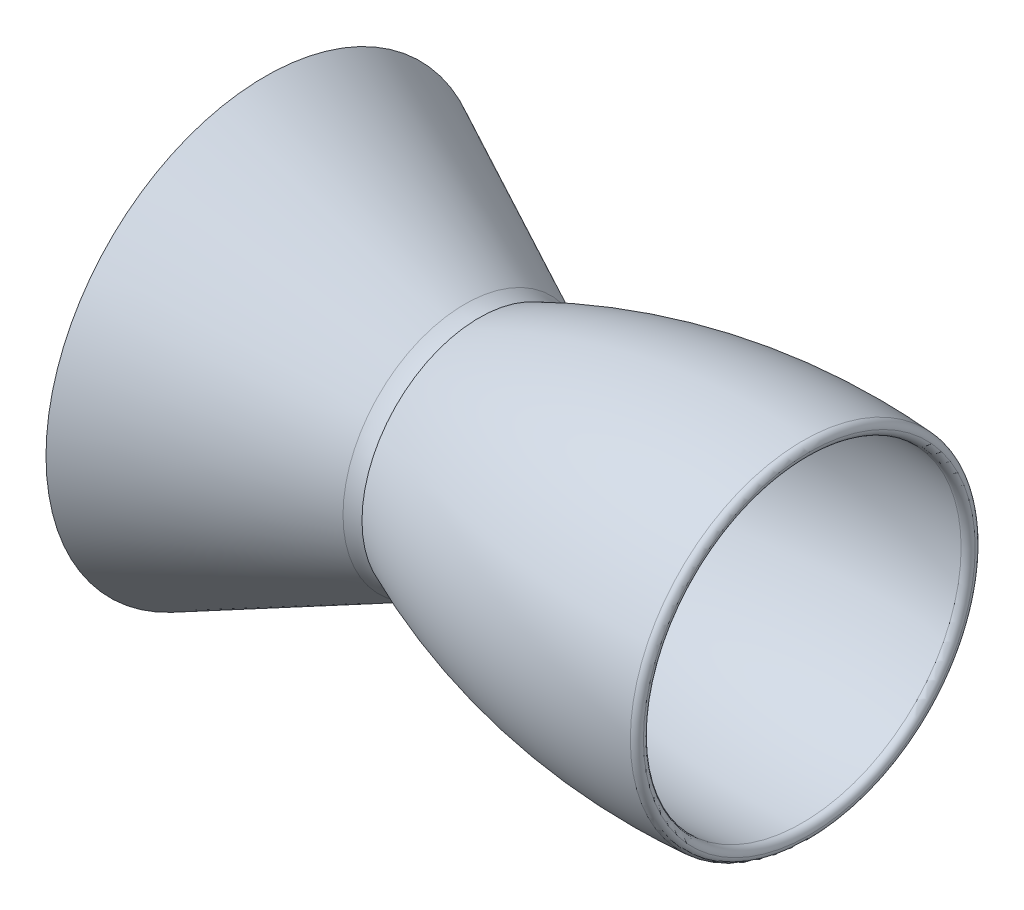
ISO-10303-21;
HEADER;
FILE_DESCRIPTION(('STEP AP214'),'2;1');
FILE_NAME('part.step','',(''),(''),'','','');
FILE_SCHEMA(('AUTOMOTIVE_DESIGN { 1 0 10303 214 1 1 1 1 }'));
ENDSEC;
DATA;
#1=APPLICATION_CONTEXT('core data for automotive mechanical design processes');
#2=APPLICATION_PROTOCOL_DEFINITION('international standard','automotive_design',2000,#1);
#3=PRODUCT_CONTEXT('',#1,'mechanical');
#4=PRODUCT('Part','Part','',(#3));
#5=PRODUCT_RELATED_PRODUCT_CATEGORY('part','',(#4));
#6=PRODUCT_DEFINITION_FORMATION('','',#4);
#7=PRODUCT_DEFINITION_CONTEXT('part definition',#1,'design');
#8=PRODUCT_DEFINITION('design','',#6,#7);
#9=PRODUCT_DEFINITION_SHAPE('','',#8);
#10=(LENGTH_UNIT() NAMED_UNIT(*) SI_UNIT(.MILLI.,.METRE.));
#11=(NAMED_UNIT(*) PLANE_ANGLE_UNIT() SI_UNIT($,.RADIAN.));
#12=(NAMED_UNIT(*) SI_UNIT($,.STERADIAN.) SOLID_ANGLE_UNIT());
#13=UNCERTAINTY_MEASURE_WITH_UNIT(LENGTH_MEASURE(1.E-05),#10,'distance_accuracy_value','');
#14=(GEOMETRIC_REPRESENTATION_CONTEXT(3) GLOBAL_UNCERTAINTY_ASSIGNED_CONTEXT((#13)) GLOBAL_UNIT_ASSIGNED_CONTEXT((#10,
#11,#12)) REPRESENTATION_CONTEXT('',''));
#15=CARTESIAN_POINT('',(0.,0.,0.));
#16=DIRECTION('',(0.,0.,1.));
#17=DIRECTION('',(1.,0.,0.));
#18=AXIS2_PLACEMENT_3D('',#15,#16,#17);
#19=CARTESIAN_POINT('',(-1000.,805.623054689813,0.));
#20=DIRECTION('',(1.,0.,0.));
#21=DIRECTION('',(0.,0.,-1.));
#22=AXIS2_PLACEMENT_3D('',#19,#20,#21);
#23=PLANE('',#22);
#24=CARTESIAN_POINT('',(-1000.,0.,0.));
#25=DIRECTION('',(-1.,0.,0.));
#26=DIRECTION('',(0.,0.,1.));
#27=AXIS2_PLACEMENT_3D('',#24,#25,#26);
#28=CIRCLE('',#27,750.);
#29=CARTESIAN_POINT('',(-1000.,0.,750.));
#30=VERTEX_POINT('',#29);
#31=EDGE_CURVE('E47',#30,#30,#28,.T.);
#32=ORIENTED_EDGE('',*,*,#31,.F.);
#33=EDGE_LOOP('',(#32));
#34=FACE_BOUND('',#33,.T.);
#35=CARTESIAN_POINT('',(-1000.,0.,0.));
#36=DIRECTION('',(-1.,0.,0.));
#37=DIRECTION('',(0.,0.,1.));
#38=AXIS2_PLACEMENT_3D('',#35,#36,#37);
#39=CIRCLE('',#38,805.623054689813);
#40=CARTESIAN_POINT('',(-1000.,0.,805.623054689813));
#41=VERTEX_POINT('',#40);
#42=EDGE_CURVE('E68',#41,#41,#39,.T.);
#43=ORIENTED_EDGE('',*,*,#42,.T.);
#44=EDGE_LOOP('',(#43));
#45=FACE_BOUND('',#44,.T.);
#46=ADVANCED_FACE('F40',(#34,#45),#23,.F.);
#47=CARTESIAN_POINT('',(-1000.,0.,0.));
#48=DIRECTION('',(-1.,0.,0.));
#49=DIRECTION('',(0.,0.,1.));
#50=AXIS2_PLACEMENT_3D('',#47,#48,#49);
#51=CONICAL_SURFACE('',#50,750.,0.453525951153303);
#52=CARTESIAN_POINT('',(-287.967384529995,0.,0.));
#53=DIRECTION('',(-1.,0.,0.));
#54=DIRECTION('',(0.,0.,1.));
#55=AXIS2_PLACEMENT_3D('',#52,#53,#54);
#56=CIRCLE('',#55,402.947323104328);
#57=CARTESIAN_POINT('',(-287.967384529995,0.,402.947323104328));
#58=VERTEX_POINT('',#57);
#59=EDGE_CURVE('E53',#58,#58,#56,.T.);
#60=ORIENTED_EDGE('',*,*,#59,.F.);
#61=EDGE_LOOP('',(#60));
#62=FACE_BOUND('',#61,.T.);
#63=ORIENTED_EDGE('',*,*,#31,.T.);
#64=EDGE_LOOP('',(#63));
#65=FACE_BOUND('',#64,.T.);
#66=ADVANCED_FACE('F86',(#62,#65),#51,.F.);
#67=CARTESIAN_POINT('',(-178.432945475854,0.,0.));
#68=DIRECTION('',(-1.,0.,0.));
#69=DIRECTION('',(0.,0.,1.));
#70=AXIS2_PLACEMENT_3D('',#67,#68,#69);
#71=TOROIDAL_SURFACE('',#70,627.674283349633,250.);
#72=CARTESIAN_POINT('',(-206.468100909638,0.,0.));
#73=DIRECTION('',(-1.,0.,0.));
#74=DIRECTION('',(0.,0.,1.));
#75=AXIS2_PLACEMENT_3D('',#72,#73,#74);
#76=CIRCLE('',#75,379.251196540448);
#77=CARTESIAN_POINT('',(-206.468100909638,0.,379.251196540448));
#78=VERTEX_POINT('',#77);
#79=EDGE_CURVE('E60',#78,#78,#76,.T.);
#80=ORIENTED_EDGE('',*,*,#79,.F.);
#81=EDGE_LOOP('',(#80));
#82=FACE_BOUND('',#81,.T.);
#83=ORIENTED_EDGE('',*,*,#59,.T.);
#84=EDGE_LOOP('',(#83));
#85=FACE_BOUND('',#84,.T.);
#86=ADVANCED_FACE('F94',(#82,#85),#71,.T.);
#87=CARTESIAN_POINT('',(800.115407155424,0.,0.));
#88=DIRECTION('',(-1.,0.,0.));
#89=DIRECTION('',(0.,0.,1.));
#90=AXIS2_PLACEMENT_3D('',#87,#88,#89);
#91=DEGENERATE_TOROIDAL_SURFACE('',#90,1910.36815962349,2501.11318313049,.F.);
#92=CARTESIAN_POINT('',(973.269232411947,0.,0.));
#93=DIRECTION('',(-1.,0.,0.));
#94=DIRECTION('',(0.,0.,1.));
#95=AXIS2_PLACEMENT_3D('',#92,#93,#94);
#96=CIRCLE('',#95,584.744043791052);
#97=CARTESIAN_POINT('',(973.269232411947,0.,584.744043791052));
#98=VERTEX_POINT('',#97);
#99=EDGE_CURVE('E10',#98,#98,#96,.F.);
#100=ORIENTED_EDGE('',*,*,#99,.T.);
#101=EDGE_LOOP('',(#100));
#102=FACE_BOUND('',#101,.T.);
#103=ORIENTED_EDGE('',*,*,#79,.T.);
#104=EDGE_LOOP('',(#103));
#105=FACE_BOUND('',#104,.T.);
#106=ADVANCED_FACE('F101',(#102,#105),#91,.T.);
#107=CARTESIAN_POINT('',(800.115407155424,0.,0.));
#108=DIRECTION('',(-1.,0.,0.));
#109=DIRECTION('',(0.,0.,1.));
#110=AXIS2_PLACEMENT_3D('',#107,#108,#109);
#111=DEGENERATE_TOROIDAL_SURFACE('',#110,1910.36815962349,2551.11318313049,.F.);
#112=CARTESIAN_POINT('',(976.730767588052,0.,0.));
#113=DIRECTION('',(-1.,0.,0.));
#114=DIRECTION('',(0.,0.,1.));
#115=AXIS2_PLACEMENT_3D('',#112,#113,#114);
#116=CIRCLE('',#115,634.624077614463);
#117=CARTESIAN_POINT('',(976.730767588052,0.,634.624077614463));
#118=VERTEX_POINT('',#117);
#119=EDGE_CURVE('E44',#118,#118,#116,.T.);
#120=ORIENTED_EDGE('',*,*,#119,.T.);
#121=EDGE_LOOP('',(#120));
#122=FACE_BOUND('',#121,.T.);
#123=CARTESIAN_POINT('',(-213.437966266576,0.,0.));
#124=DIRECTION('',(-1.,0.,0.));
#125=DIRECTION('',(0.,0.,1.));
#126=AXIS2_PLACEMENT_3D('',#123,#124,#125);
#127=CIRCLE('',#126,430.761489150168);
#128=CARTESIAN_POINT('',(-213.437966266576,0.,430.761489150168));
#129=VERTEX_POINT('',#128);
#130=EDGE_CURVE('E58',#129,#129,#127,.T.);
#131=ORIENTED_EDGE('',*,*,#130,.F.);
#132=EDGE_LOOP('',(#131));
#133=FACE_BOUND('',#132,.T.);
#134=ADVANCED_FACE('F104',(#122,#133),#111,.F.);
#135=CARTESIAN_POINT('',(-178.432945475854,0.,0.));
#136=DIRECTION('',(-1.,0.,0.));
#137=DIRECTION('',(0.,0.,1.));
#138=AXIS2_PLACEMENT_3D('',#135,#136,#137);
#139=TOROIDAL_SURFACE('',#138,627.674283349633,199.999999999999);
#140=CARTESIAN_POINT('',(-266.060496719167,0.,0.));
#141=DIRECTION('',(-1.,0.,0.));
#142=DIRECTION('',(0.,0.,1.));
#143=AXIS2_PLACEMENT_3D('',#140,#141,#142);
#144=CIRCLE('',#143,447.89271515339);
#145=CARTESIAN_POINT('',(-266.060496719167,0.,447.89271515339));
#146=VERTEX_POINT('',#145);
#147=EDGE_CURVE('E65',#146,#146,#144,.T.);
#148=ORIENTED_EDGE('',*,*,#147,.F.);
#149=EDGE_LOOP('',(#148));
#150=FACE_BOUND('',#149,.T.);
#151=ORIENTED_EDGE('',*,*,#130,.T.);
#152=EDGE_LOOP('',(#151));
#153=FACE_BOUND('',#152,.T.);
#154=ADVANCED_FACE('F84',(#150,#153),#139,.F.);
#155=CARTESIAN_POINT('',(-266.060496719167,0.,0.));
#156=DIRECTION('',(-1.,0.,0.));
#157=DIRECTION('',(0.,0.,1.));
#158=AXIS2_PLACEMENT_3D('',#155,#156,#157);
#159=CONICAL_SURFACE('',#158,447.89271515339,0.453525951153302);
#160=ORIENTED_EDGE('',*,*,#42,.F.);
#161=EDGE_LOOP('',(#160));
#162=FACE_BOUND('',#161,.T.);
#163=ORIENTED_EDGE('',*,*,#147,.T.);
#164=EDGE_LOOP('',(#163));
#165=FACE_BOUND('',#164,.T.);
#166=ADVANCED_FACE('F76',(#162,#165),#159,.T.);
#167=CARTESIAN_POINT('',(975.,0.,0.));
#168=DIRECTION('',(-1.,0.,0.));
#169=DIRECTION('',(0.,0.,1.));
#170=AXIS2_PLACEMENT_3D('',#167,#168,#169);
#171=TOROIDAL_SURFACE('',#170,609.684060702758,25.);
#172=ORIENTED_EDGE('',*,*,#99,.F.);
#173=EDGE_LOOP('',(#172));
#174=FACE_BOUND('',#173,.T.);
#175=CARTESIAN_POINT('',(1000.,0.,0.));
#176=DIRECTION('',(-1.,0.,0.));
#177=DIRECTION('',(0.,0.,1.));
#178=AXIS2_PLACEMENT_3D('',#175,#176,#177);
#179=CIRCLE('',#178,609.684060702758);
#180=CARTESIAN_POINT('',(1000.,0.,609.684060702758));
#181=VERTEX_POINT('',#180);
#182=EDGE_CURVE('E41',#181,#181,#179,.T.);
#183=ORIENTED_EDGE('',*,*,#182,.F.);
#184=EDGE_LOOP('',(#183));
#185=FACE_BOUND('',#184,.T.);
#186=ADVANCED_FACE('F39',(#174,#185),#171,.T.);
#187=CARTESIAN_POINT('',(975.,0.,0.));
#188=DIRECTION('',(-1.,0.,0.));
#189=DIRECTION('',(0.,0.,1.));
#190=AXIS2_PLACEMENT_3D('',#187,#188,#189);
#191=TOROIDAL_SURFACE('',#190,609.684060702758,25.);
#192=ORIENTED_EDGE('',*,*,#182,.T.);
#193=EDGE_LOOP('',(#192));
#194=FACE_BOUND('',#193,.T.);
#195=ORIENTED_EDGE('',*,*,#119,.F.);
#196=EDGE_LOOP('',(#195));
#197=FACE_BOUND('',#196,.T.);
#198=ADVANCED_FACE('F71',(#194,#197),#191,.T.);
#199=CLOSED_SHELL('',(#46,#66,#86,#106,#134,#154,#166,#186,#198));
#200=MANIFOLD_SOLID_BREP('B2',#199);
#201=ADVANCED_BREP_SHAPE_REPRESENTATION('',(#18,#200),#14);
#202=SHAPE_DEFINITION_REPRESENTATION(#9,#201);
ENDSEC;
END-ISO-10303-21;
